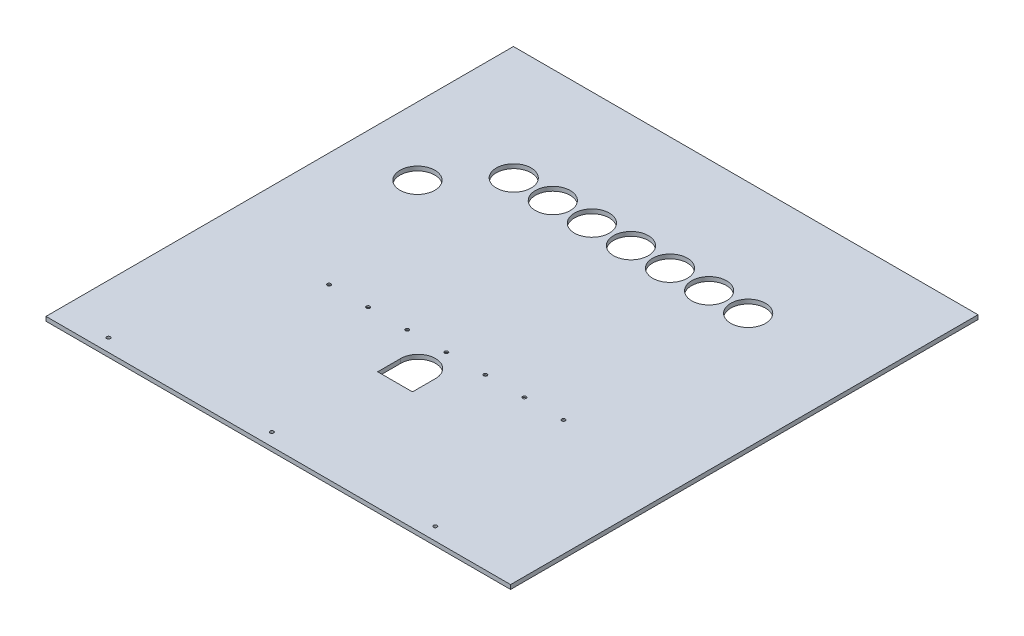
ISO-10303-21;
HEADER;
FILE_DESCRIPTION(('STEP AP214'),'2;1');
FILE_NAME('part.step','',(''),(''),'','','');
FILE_SCHEMA(('AUTOMOTIVE_DESIGN { 1 0 10303 214 1 1 1 1 }'));
ENDSEC;
DATA;
#1=APPLICATION_CONTEXT('core data for automotive mechanical design processes');
#2=APPLICATION_PROTOCOL_DEFINITION('international standard','automotive_design',2000,#1);
#3=PRODUCT_CONTEXT('',#1,'mechanical');
#4=PRODUCT('Part','Part','',(#3));
#5=PRODUCT_RELATED_PRODUCT_CATEGORY('part','',(#4));
#6=PRODUCT_DEFINITION_FORMATION('','',#4);
#7=PRODUCT_DEFINITION_CONTEXT('part definition',#1,'design');
#8=PRODUCT_DEFINITION('design','',#6,#7);
#9=PRODUCT_DEFINITION_SHAPE('','',#8);
#10=(LENGTH_UNIT() NAMED_UNIT(*) SI_UNIT(.MILLI.,.METRE.));
#11=(NAMED_UNIT(*) PLANE_ANGLE_UNIT() SI_UNIT($,.RADIAN.));
#12=(NAMED_UNIT(*) SI_UNIT($,.STERADIAN.) SOLID_ANGLE_UNIT());
#13=UNCERTAINTY_MEASURE_WITH_UNIT(LENGTH_MEASURE(1.E-05),#10,'distance_accuracy_value','');
#14=(GEOMETRIC_REPRESENTATION_CONTEXT(3) GLOBAL_UNCERTAINTY_ASSIGNED_CONTEXT((#13)) GLOBAL_UNIT_ASSIGNED_CONTEXT((#10,
#11,#12)) REPRESENTATION_CONTEXT('',''));
#15=CARTESIAN_POINT('',(0.,0.,0.));
#16=DIRECTION('',(0.,0.,1.));
#17=DIRECTION('',(1.,0.,0.));
#18=AXIS2_PLACEMENT_3D('',#15,#16,#17);
#19=CARTESIAN_POINT('',(0.,6.,0.));
#20=DIRECTION('',(0.,-1.,0.));
#21=DIRECTION('',(0.,0.,-1.));
#22=AXIS2_PLACEMENT_3D('',#19,#20,#21);
#23=PLANE('',#22);
#24=CARTESIAN_POINT('',(230.,6.,286.23));
#25=DIRECTION('',(0.,1.,0.));
#26=DIRECTION('',(0.,0.,1.));
#27=AXIS2_PLACEMENT_3D('',#24,#25,#26);
#28=CIRCLE('',#27,2.5);
#29=CARTESIAN_POINT('',(230.,6.,288.73));
#30=VERTEX_POINT('',#29);
#31=EDGE_CURVE('E100',#30,#30,#28,.T.);
#32=ORIENTED_EDGE('',*,*,#31,.F.);
#33=EDGE_LOOP('',(#32));
#34=FACE_BOUND('',#33,.T.);
#35=CARTESIAN_POINT('',(0.,6.,286.23));
#36=DIRECTION('',(0.,1.,0.));
#37=DIRECTION('',(0.,0.,1.));
#38=AXIS2_PLACEMENT_3D('',#35,#36,#37);
#39=CIRCLE('',#38,2.5);
#40=CARTESIAN_POINT('',(0.,6.,288.73));
#41=VERTEX_POINT('',#40);
#42=EDGE_CURVE('E121',#41,#41,#39,.T.);
#43=ORIENTED_EDGE('',*,*,#42,.F.);
#44=EDGE_LOOP('',(#43));
#45=FACE_BOUND('',#44,.T.);
#46=CARTESIAN_POINT('',(-230.,6.,286.23));
#47=DIRECTION('',(0.,1.,0.));
#48=DIRECTION('',(0.,0.,1.));
#49=AXIS2_PLACEMENT_3D('',#46,#47,#48);
#50=CIRCLE('',#49,2.5);
#51=CARTESIAN_POINT('',(-230.,6.,288.73));
#52=VERTEX_POINT('',#51);
#53=EDGE_CURVE('E125',#52,#52,#50,.T.);
#54=ORIENTED_EDGE('',*,*,#53,.F.);
#55=EDGE_LOOP('',(#54));
#56=FACE_BOUND('',#55,.T.);
#57=CARTESIAN_POINT('',(25.5000000000006,6.,105.904736767257));
#58=DIRECTION('',(0.,-1.,0.));
#59=DIRECTION('',(0.,0.,-1.));
#60=AXIS2_PLACEMENT_3D('',#57,#58,#59);
#61=CIRCLE('',#60,24.5);
#62=CARTESIAN_POINT('',(50.0000000000008,6.,105.904736767257));
#63=VERTEX_POINT('',#62);
#64=CARTESIAN_POINT('',(1.00000000000035,6.,105.904736767257));
#65=VERTEX_POINT('',#64);
#66=EDGE_CURVE('E130',#63,#65,#61,.F.);
#67=ORIENTED_EDGE('',*,*,#66,.F.);
#68=DIRECTION('',(0.,0.,-1.));
#69=VECTOR('',#68,1.);
#70=CARTESIAN_POINT('',(50.0000000000006,6.,138.347210855597));
#71=LINE('',#70,#69);
#72=CARTESIAN_POINT('',(50.0000000000006,6.,138.347210855597));
#73=VERTEX_POINT('',#72);
#74=EDGE_CURVE('E133',#73,#63,#71,.T.);
#75=ORIENTED_EDGE('',*,*,#74,.F.);
#76=DIRECTION('',(1.,0.,0.));
#77=VECTOR('',#76,1.);
#78=CARTESIAN_POINT('',(50.0000000000006,6.,138.347210855597));
#79=LINE('',#78,#77);
#80=CARTESIAN_POINT('',(1.00000000000035,6.,138.347210855597));
#81=VERTEX_POINT('',#80);
#82=EDGE_CURVE('E149',#81,#73,#79,.T.);
#83=ORIENTED_EDGE('',*,*,#82,.F.);
#84=DIRECTION('',(0.,0.,1.));
#85=VECTOR('',#84,1.);
#86=CARTESIAN_POINT('',(1.00000000000035,6.,138.347210855597));
#87=LINE('',#86,#85);
#88=EDGE_CURVE('E34',#65,#81,#87,.T.);
#89=ORIENTED_EDGE('',*,*,#88,.F.);
#90=EDGE_LOOP('',(#67,#75,#83,#89));
#91=FACE_BOUND('',#90,.T.);
#92=CARTESIAN_POINT('',(190.5,6.,66.27));
#93=DIRECTION('',(0.,1.,0.));
#94=DIRECTION('',(0.,0.,1.));
#95=AXIS2_PLACEMENT_3D('',#92,#93,#94);
#96=CIRCLE('',#95,2.5);
#97=CARTESIAN_POINT('',(190.5,6.,68.77));
#98=VERTEX_POINT('',#97);
#99=EDGE_CURVE('E240',#98,#98,#96,.T.);
#100=ORIENTED_EDGE('',*,*,#99,.F.);
#101=EDGE_LOOP('',(#100));
#102=FACE_BOUND('',#101,.T.);
#103=CARTESIAN_POINT('',(135.5,6.,66.27));
#104=DIRECTION('',(0.,1.,0.));
#105=DIRECTION('',(0.,0.,1.));
#106=AXIS2_PLACEMENT_3D('',#103,#104,#105);
#107=CIRCLE('',#106,2.5);
#108=CARTESIAN_POINT('',(135.5,6.,68.77));
#109=VERTEX_POINT('',#108);
#110=EDGE_CURVE('E234',#109,#109,#107,.T.);
#111=ORIENTED_EDGE('',*,*,#110,.F.);
#112=EDGE_LOOP('',(#111));
#113=FACE_BOUND('',#112,.T.);
#114=CARTESIAN_POINT('',(80.5,6.,66.27));
#115=DIRECTION('',(0.,1.,0.));
#116=DIRECTION('',(0.,0.,1.));
#117=AXIS2_PLACEMENT_3D('',#114,#115,#116);
#118=CIRCLE('',#117,2.5);
#119=CARTESIAN_POINT('',(80.5,6.,68.77));
#120=VERTEX_POINT('',#119);
#121=EDGE_CURVE('E228',#120,#120,#118,.T.);
#122=ORIENTED_EDGE('',*,*,#121,.F.);
#123=EDGE_LOOP('',(#122));
#124=FACE_BOUND('',#123,.T.);
#125=CARTESIAN_POINT('',(25.5,6.,66.27));
#126=DIRECTION('',(0.,1.,0.));
#127=DIRECTION('',(0.,0.,1.));
#128=AXIS2_PLACEMENT_3D('',#125,#126,#127);
#129=CIRCLE('',#128,2.5);
#130=CARTESIAN_POINT('',(25.5,6.,68.77));
#131=VERTEX_POINT('',#130);
#132=EDGE_CURVE('E222',#131,#131,#129,.T.);
#133=ORIENTED_EDGE('',*,*,#132,.F.);
#134=EDGE_LOOP('',(#133));
#135=FACE_BOUND('',#134,.T.);
#136=CARTESIAN_POINT('',(-29.5,6.,66.27));
#137=DIRECTION('',(0.,1.,0.));
#138=DIRECTION('',(0.,0.,1.));
#139=AXIS2_PLACEMENT_3D('',#136,#137,#138);
#140=CIRCLE('',#139,2.5);
#141=CARTESIAN_POINT('',(-29.5,6.,68.77));
#142=VERTEX_POINT('',#141);
#143=EDGE_CURVE('E216',#142,#142,#140,.T.);
#144=ORIENTED_EDGE('',*,*,#143,.F.);
#145=EDGE_LOOP('',(#144));
#146=FACE_BOUND('',#145,.T.);
#147=CARTESIAN_POINT('',(-84.5,6.,66.27));
#148=DIRECTION('',(0.,1.,0.));
#149=DIRECTION('',(0.,0.,1.));
#150=AXIS2_PLACEMENT_3D('',#147,#148,#149);
#151=CIRCLE('',#150,2.5);
#152=CARTESIAN_POINT('',(-84.5,6.,68.77));
#153=VERTEX_POINT('',#152);
#154=EDGE_CURVE('E210',#153,#153,#151,.T.);
#155=ORIENTED_EDGE('',*,*,#154,.F.);
#156=EDGE_LOOP('',(#155));
#157=FACE_BOUND('',#156,.T.);
#158=CARTESIAN_POINT('',(-139.5,6.,66.27));
#159=DIRECTION('',(0.,1.,0.));
#160=DIRECTION('',(0.,0.,1.));
#161=AXIS2_PLACEMENT_3D('',#158,#159,#160);
#162=CIRCLE('',#161,2.5);
#163=CARTESIAN_POINT('',(-139.5,6.,68.77));
#164=VERTEX_POINT('',#163);
#165=EDGE_CURVE('E186',#164,#164,#162,.T.);
#166=ORIENTED_EDGE('',*,*,#165,.F.);
#167=EDGE_LOOP('',(#166));
#168=FACE_BOUND('',#167,.T.);
#169=CARTESIAN_POINT('',(-139.5,6.,-193.73));
#170=DIRECTION('',(0.,1.,0.));
#171=DIRECTION('',(0.,0.,1.));
#172=AXIS2_PLACEMENT_3D('',#169,#170,#171);
#173=CIRCLE('',#172,24.5);
#174=CARTESIAN_POINT('',(-139.5,6.,-169.23));
#175=VERTEX_POINT('',#174);
#176=EDGE_CURVE('E193',#175,#175,#173,.T.);
#177=ORIENTED_EDGE('',*,*,#176,.F.);
#178=EDGE_LOOP('',(#177));
#179=FACE_BOUND('',#178,.T.);
#180=CARTESIAN_POINT('',(-84.5,6.,-193.73));
#181=DIRECTION('',(0.,1.,0.));
#182=DIRECTION('',(0.,0.,1.));
#183=AXIS2_PLACEMENT_3D('',#180,#181,#182);
#184=CIRCLE('',#183,24.5);
#185=CARTESIAN_POINT('',(-84.5,6.,-169.23));
#186=VERTEX_POINT('',#185);
#187=EDGE_CURVE('E197',#186,#186,#184,.T.);
#188=ORIENTED_EDGE('',*,*,#187,.F.);
#189=EDGE_LOOP('',(#188));
#190=FACE_BOUND('',#189,.T.);
#191=CARTESIAN_POINT('',(-29.5,6.,-193.73));
#192=DIRECTION('',(0.,1.,0.));
#193=DIRECTION('',(0.,0.,1.));
#194=AXIS2_PLACEMENT_3D('',#191,#192,#193);
#195=CIRCLE('',#194,24.5);
#196=CARTESIAN_POINT('',(-29.5,6.,-169.23));
#197=VERTEX_POINT('',#196);
#198=EDGE_CURVE('E200',#197,#197,#195,.T.);
#199=ORIENTED_EDGE('',*,*,#198,.F.);
#200=EDGE_LOOP('',(#199));
#201=FACE_BOUND('',#200,.T.);
#202=CARTESIAN_POINT('',(25.5,6.,-193.73));
#203=DIRECTION('',(0.,1.,0.));
#204=DIRECTION('',(0.,0.,1.));
#205=AXIS2_PLACEMENT_3D('',#202,#203,#204);
#206=CIRCLE('',#205,24.5);
#207=CARTESIAN_POINT('',(25.5,6.,-169.23));
#208=VERTEX_POINT('',#207);
#209=EDGE_CURVE('E190',#208,#208,#206,.T.);
#210=ORIENTED_EDGE('',*,*,#209,.F.);
#211=EDGE_LOOP('',(#210));
#212=FACE_BOUND('',#211,.T.);
#213=CARTESIAN_POINT('',(-204.5,6.,-123.171883561143));
#214=DIRECTION('',(0.,1.,0.));
#215=DIRECTION('',(0.,0.,1.));
#216=AXIS2_PLACEMENT_3D('',#213,#214,#215);
#217=CIRCLE('',#216,24.5);
#218=CARTESIAN_POINT('',(-204.5,6.,-98.6718835611434));
#219=VERTEX_POINT('',#218);
#220=EDGE_CURVE('E196',#219,#219,#217,.T.);
#221=ORIENTED_EDGE('',*,*,#220,.F.);
#222=EDGE_LOOP('',(#221));
#223=FACE_BOUND('',#222,.T.);
#224=DIRECTION('',(1.,0.,0.));
#225=VECTOR('',#224,1.);
#226=CARTESIAN_POINT('',(-300.,6.,304.23));
#227=LINE('',#226,#225);
#228=CARTESIAN_POINT('',(-300.,6.,304.23));
#229=VERTEX_POINT('',#228);
#230=CARTESIAN_POINT('',(354.,6.,304.23));
#231=VERTEX_POINT('',#230);
#232=EDGE_CURVE('E26',#229,#231,#227,.T.);
#233=ORIENTED_EDGE('',*,*,#232,.T.);
#234=DIRECTION('',(0.,0.,-1.));
#235=VECTOR('',#234,1.);
#236=CARTESIAN_POINT('',(354.,6.,-353.77));
#237=LINE('',#236,#235);
#238=CARTESIAN_POINT('',(354.,6.,-353.77));
#239=VERTEX_POINT('',#238);
#240=EDGE_CURVE('E87',#231,#239,#237,.T.);
#241=ORIENTED_EDGE('',*,*,#240,.T.);
#242=DIRECTION('',(-1.,0.,0.));
#243=VECTOR('',#242,1.);
#244=CARTESIAN_POINT('',(-300.,6.,-353.77));
#245=LINE('',#244,#243);
#246=CARTESIAN_POINT('',(-300.,6.,-353.77));
#247=VERTEX_POINT('',#246);
#248=EDGE_CURVE('E106',#239,#247,#245,.T.);
#249=ORIENTED_EDGE('',*,*,#248,.T.);
#250=DIRECTION('',(0.,0.,1.));
#251=VECTOR('',#250,1.);
#252=CARTESIAN_POINT('',(-300.,6.,304.23));
#253=LINE('',#252,#251);
#254=EDGE_CURVE('E89',#247,#229,#253,.T.);
#255=ORIENTED_EDGE('',*,*,#254,.T.);
#256=EDGE_LOOP('',(#233,#241,#249,#255));
#257=FACE_BOUND('',#256,.T.);
#258=CARTESIAN_POINT('',(80.5,6.,-193.73));
#259=DIRECTION('',(0.,1.,0.));
#260=DIRECTION('',(0.,0.,1.));
#261=AXIS2_PLACEMENT_3D('',#258,#259,#260);
#262=CIRCLE('',#261,24.5);
#263=CARTESIAN_POINT('',(80.5,6.,-169.23));
#264=VERTEX_POINT('',#263);
#265=EDGE_CURVE('E187',#264,#264,#262,.F.);
#266=ORIENTED_EDGE('',*,*,#265,.T.);
#267=EDGE_LOOP('',(#266));
#268=FACE_BOUND('',#267,.T.);
#269=CARTESIAN_POINT('',(135.5,6.,-193.73));
#270=DIRECTION('',(0.,1.,0.));
#271=DIRECTION('',(0.,0.,1.));
#272=AXIS2_PLACEMENT_3D('',#269,#270,#271);
#273=CIRCLE('',#272,24.5);
#274=CARTESIAN_POINT('',(135.5,6.,-169.23));
#275=VERTEX_POINT('',#274);
#276=EDGE_CURVE('E185',#275,#275,#273,.F.);
#277=ORIENTED_EDGE('',*,*,#276,.T.);
#278=EDGE_LOOP('',(#277));
#279=FACE_BOUND('',#278,.T.);
#280=CARTESIAN_POINT('',(190.5,6.,-193.73));
#281=DIRECTION('',(0.,1.,0.));
#282=DIRECTION('',(0.,0.,1.));
#283=AXIS2_PLACEMENT_3D('',#280,#281,#282);
#284=CIRCLE('',#283,24.5);
#285=CARTESIAN_POINT('',(190.5,6.,-169.23));
#286=VERTEX_POINT('',#285);
#287=EDGE_CURVE('E182',#286,#286,#284,.F.);
#288=ORIENTED_EDGE('',*,*,#287,.T.);
#289=EDGE_LOOP('',(#288));
#290=FACE_BOUND('',#289,.T.);
#291=ADVANCED_FACE('F17',(#34,#45,#56,#91,#102,#113,#124,#135,#146,#157,#168,#179,#190,#201,
#212,#223,#257,#268,#279,#290),#23,.F.);
#292=CARTESIAN_POINT('',(-300.,6.,304.23));
#293=DIRECTION('',(1.,0.,0.));
#294=DIRECTION('',(0.,0.,-1.));
#295=AXIS2_PLACEMENT_3D('',#292,#293,#294);
#296=PLANE('',#295);
#297=DIRECTION('',(0.,0.,1.));
#298=VECTOR('',#297,1.);
#299=CARTESIAN_POINT('',(-300.,0.,304.23));
#300=LINE('',#299,#298);
#301=CARTESIAN_POINT('',(-300.,0.,-353.77));
#302=VERTEX_POINT('',#301);
#303=CARTESIAN_POINT('',(-300.,0.,304.23));
#304=VERTEX_POINT('',#303);
#305=EDGE_CURVE('E247',#302,#304,#300,.T.);
#306=ORIENTED_EDGE('',*,*,#305,.T.);
#307=DIRECTION('',(0.,-1.,0.));
#308=VECTOR('',#307,1.);
#309=CARTESIAN_POINT('',(-300.,6.,304.23));
#310=LINE('',#309,#308);
#311=EDGE_CURVE('E11',#229,#304,#310,.T.);
#312=ORIENTED_EDGE('',*,*,#311,.F.);
#313=ORIENTED_EDGE('',*,*,#254,.F.);
#314=DIRECTION('',(0.,-1.,0.));
#315=VECTOR('',#314,1.);
#316=CARTESIAN_POINT('',(-300.,6.,-353.77));
#317=LINE('',#316,#315);
#318=EDGE_CURVE('E109',#247,#302,#317,.T.);
#319=ORIENTED_EDGE('',*,*,#318,.T.);
#320=EDGE_LOOP('',(#306,#312,#313,#319));
#321=FACE_BOUND('',#320,.T.);
#322=ADVANCED_FACE('F19',(#321),#296,.F.);
#323=CARTESIAN_POINT('',(-300.,6.,304.23));
#324=DIRECTION('',(0.,0.,-1.));
#325=DIRECTION('',(-1.,0.,0.));
#326=AXIS2_PLACEMENT_3D('',#323,#324,#325);
#327=PLANE('',#326);
#328=DIRECTION('',(1.,0.,0.));
#329=VECTOR('',#328,1.);
#330=CARTESIAN_POINT('',(-300.,0.,304.23));
#331=LINE('',#330,#329);
#332=CARTESIAN_POINT('',(354.,0.,304.23));
#333=VERTEX_POINT('',#332);
#334=EDGE_CURVE('E97',#304,#333,#331,.T.);
#335=ORIENTED_EDGE('',*,*,#334,.T.);
#336=DIRECTION('',(0.,-1.,0.));
#337=VECTOR('',#336,1.);
#338=CARTESIAN_POINT('',(354.,6.,304.23));
#339=LINE('',#338,#337);
#340=EDGE_CURVE('E94',#231,#333,#339,.T.);
#341=ORIENTED_EDGE('',*,*,#340,.F.);
#342=ORIENTED_EDGE('',*,*,#232,.F.);
#343=ORIENTED_EDGE('',*,*,#311,.T.);
#344=EDGE_LOOP('',(#335,#341,#342,#343));
#345=FACE_BOUND('',#344,.T.);
#346=ADVANCED_FACE('F95',(#345),#327,.F.);
#347=CARTESIAN_POINT('',(0.,0.,0.));
#348=DIRECTION('',(0.,-1.,0.));
#349=DIRECTION('',(0.,0.,-1.));
#350=AXIS2_PLACEMENT_3D('',#347,#348,#349);
#351=PLANE('',#350);
#352=CARTESIAN_POINT('',(230.,0.,286.23));
#353=DIRECTION('',(0.,-1.,0.));
#354=DIRECTION('',(0.,0.,-1.));
#355=AXIS2_PLACEMENT_3D('',#352,#353,#354);
#356=CIRCLE('',#355,2.5);
#357=CARTESIAN_POINT('',(230.,0.,283.73));
#358=VERTEX_POINT('',#357);
#359=EDGE_CURVE('E21',#358,#358,#356,.T.);
#360=ORIENTED_EDGE('',*,*,#359,.F.);
#361=EDGE_LOOP('',(#360));
#362=FACE_BOUND('',#361,.T.);
#363=CARTESIAN_POINT('',(0.,0.,286.23));
#364=DIRECTION('',(0.,-1.,0.));
#365=DIRECTION('',(0.,0.,-1.));
#366=AXIS2_PLACEMENT_3D('',#363,#364,#365);
#367=CIRCLE('',#366,2.5);
#368=CARTESIAN_POINT('',(0.,0.,283.73));
#369=VERTEX_POINT('',#368);
#370=EDGE_CURVE('E124',#369,#369,#367,.T.);
#371=ORIENTED_EDGE('',*,*,#370,.F.);
#372=EDGE_LOOP('',(#371));
#373=FACE_BOUND('',#372,.T.);
#374=CARTESIAN_POINT('',(-230.,0.,286.23));
#375=DIRECTION('',(0.,-1.,0.));
#376=DIRECTION('',(0.,0.,-1.));
#377=AXIS2_PLACEMENT_3D('',#374,#375,#376);
#378=CIRCLE('',#377,2.5);
#379=CARTESIAN_POINT('',(-230.,0.,283.73));
#380=VERTEX_POINT('',#379);
#381=EDGE_CURVE('E128',#380,#380,#378,.T.);
#382=ORIENTED_EDGE('',*,*,#381,.F.);
#383=EDGE_LOOP('',(#382));
#384=FACE_BOUND('',#383,.T.);
#385=DIRECTION('',(0.,0.,1.));
#386=VECTOR('',#385,1.);
#387=CARTESIAN_POINT('',(50.0000000000006,0.,138.347210855597));
#388=LINE('',#387,#386);
#389=CARTESIAN_POINT('',(50.0000000000008,0.,105.904736767257));
#390=VERTEX_POINT('',#389);
#391=CARTESIAN_POINT('',(50.0000000000006,0.,138.347210855597));
#392=VERTEX_POINT('',#391);
#393=EDGE_CURVE('E42',#390,#392,#388,.T.);
#394=ORIENTED_EDGE('',*,*,#393,.F.);
#395=CARTESIAN_POINT('',(25.5000000000006,0.,105.904736767257));
#396=DIRECTION('',(0.,-1.,0.));
#397=DIRECTION('',(0.,0.,-1.));
#398=AXIS2_PLACEMENT_3D('',#395,#396,#397);
#399=CIRCLE('',#398,24.5);
#400=CARTESIAN_POINT('',(1.00000000000035,0.,105.904736767257));
#401=VERTEX_POINT('',#400);
#402=EDGE_CURVE('E143',#401,#390,#399,.T.);
#403=ORIENTED_EDGE('',*,*,#402,.F.);
#404=DIRECTION('',(0.,0.,-1.));
#405=VECTOR('',#404,1.);
#406=CARTESIAN_POINT('',(1.00000000000035,0.,138.347210855597));
#407=LINE('',#406,#405);
#408=CARTESIAN_POINT('',(1.00000000000035,0.,138.347210855597));
#409=VERTEX_POINT('',#408);
#410=EDGE_CURVE('E140',#409,#401,#407,.T.);
#411=ORIENTED_EDGE('',*,*,#410,.F.);
#412=DIRECTION('',(-1.,0.,0.));
#413=VECTOR('',#412,1.);
#414=CARTESIAN_POINT('',(50.0000000000006,0.,138.347210855597));
#415=LINE('',#414,#413);
#416=EDGE_CURVE('E137',#392,#409,#415,.T.);
#417=ORIENTED_EDGE('',*,*,#416,.F.);
#418=EDGE_LOOP('',(#394,#403,#411,#417));
#419=FACE_BOUND('',#418,.T.);
#420=CARTESIAN_POINT('',(190.5,0.,-193.73));
#421=DIRECTION('',(0.,1.,0.));
#422=DIRECTION('',(0.,0.,1.));
#423=AXIS2_PLACEMENT_3D('',#420,#421,#422);
#424=CIRCLE('',#423,24.5);
#425=CARTESIAN_POINT('',(190.5,0.,-169.23));
#426=VERTEX_POINT('',#425);
#427=EDGE_CURVE('E167',#426,#426,#424,.T.);
#428=ORIENTED_EDGE('',*,*,#427,.T.);
#429=EDGE_LOOP('',(#428));
#430=FACE_BOUND('',#429,.T.);
#431=CARTESIAN_POINT('',(135.5,0.,-193.73));
#432=DIRECTION('',(0.,1.,0.));
#433=DIRECTION('',(0.,0.,1.));
#434=AXIS2_PLACEMENT_3D('',#431,#432,#433);
#435=CIRCLE('',#434,24.5);
#436=CARTESIAN_POINT('',(135.5,0.,-169.23));
#437=VERTEX_POINT('',#436);
#438=EDGE_CURVE('E171',#437,#437,#435,.T.);
#439=ORIENTED_EDGE('',*,*,#438,.T.);
#440=EDGE_LOOP('',(#439));
#441=FACE_BOUND('',#440,.T.);
#442=CARTESIAN_POINT('',(80.5,0.,-193.73));
#443=DIRECTION('',(0.,1.,0.));
#444=DIRECTION('',(0.,0.,1.));
#445=AXIS2_PLACEMENT_3D('',#442,#443,#444);
#446=CIRCLE('',#445,24.5);
#447=CARTESIAN_POINT('',(80.5,0.,-169.23));
#448=VERTEX_POINT('',#447);
#449=EDGE_CURVE('E174',#448,#448,#446,.T.);
#450=ORIENTED_EDGE('',*,*,#449,.T.);
#451=EDGE_LOOP('',(#450));
#452=FACE_BOUND('',#451,.T.);
#453=CARTESIAN_POINT('',(25.5,0.,-193.73));
#454=DIRECTION('',(0.,1.,0.));
#455=DIRECTION('',(0.,0.,1.));
#456=AXIS2_PLACEMENT_3D('',#453,#454,#455);
#457=CIRCLE('',#456,24.5);
#458=CARTESIAN_POINT('',(25.5,0.,-169.23));
#459=VERTEX_POINT('',#458);
#460=EDGE_CURVE('E164',#459,#459,#457,.T.);
#461=ORIENTED_EDGE('',*,*,#460,.T.);
#462=EDGE_LOOP('',(#461));
#463=FACE_BOUND('',#462,.T.);
#464=CARTESIAN_POINT('',(-204.5,0.,-123.171883561143));
#465=DIRECTION('',(0.,1.,0.));
#466=DIRECTION('',(0.,0.,1.));
#467=AXIS2_PLACEMENT_3D('',#464,#465,#466);
#468=CIRCLE('',#467,24.5);
#469=CARTESIAN_POINT('',(-204.5,0.,-98.6718835611434));
#470=VERTEX_POINT('',#469);
#471=EDGE_CURVE('E157',#470,#470,#468,.T.);
#472=ORIENTED_EDGE('',*,*,#471,.T.);
#473=EDGE_LOOP('',(#472));
#474=FACE_BOUND('',#473,.T.);
#475=CARTESIAN_POINT('',(-84.5,0.,-193.73));
#476=DIRECTION('',(0.,1.,0.));
#477=DIRECTION('',(0.,0.,1.));
#478=AXIS2_PLACEMENT_3D('',#475,#476,#477);
#479=CIRCLE('',#478,24.5);
#480=CARTESIAN_POINT('',(-84.5,0.,-169.23));
#481=VERTEX_POINT('',#480);
#482=EDGE_CURVE('E160',#481,#481,#479,.T.);
#483=ORIENTED_EDGE('',*,*,#482,.T.);
#484=EDGE_LOOP('',(#483));
#485=FACE_BOUND('',#484,.T.);
#486=CARTESIAN_POINT('',(-29.5,0.,-193.73));
#487=DIRECTION('',(0.,1.,0.));
#488=DIRECTION('',(0.,0.,1.));
#489=AXIS2_PLACEMENT_3D('',#486,#487,#488);
#490=CIRCLE('',#489,24.5);
#491=CARTESIAN_POINT('',(-29.5,0.,-169.23));
#492=VERTEX_POINT('',#491);
#493=EDGE_CURVE('E161',#492,#492,#490,.T.);
#494=ORIENTED_EDGE('',*,*,#493,.T.);
#495=EDGE_LOOP('',(#494));
#496=FACE_BOUND('',#495,.T.);
#497=CARTESIAN_POINT('',(-139.5,0.,-193.73));
#498=DIRECTION('',(0.,1.,0.));
#499=DIRECTION('',(0.,0.,1.));
#500=AXIS2_PLACEMENT_3D('',#497,#498,#499);
#501=CIRCLE('',#500,24.5);
#502=CARTESIAN_POINT('',(-139.5,0.,-169.23));
#503=VERTEX_POINT('',#502);
#504=EDGE_CURVE('E170',#503,#503,#501,.T.);
#505=ORIENTED_EDGE('',*,*,#504,.T.);
#506=EDGE_LOOP('',(#505));
#507=FACE_BOUND('',#506,.T.);
#508=DIRECTION('',(0.,0.,-1.));
#509=VECTOR('',#508,1.);
#510=CARTESIAN_POINT('',(354.,0.,-353.77));
#511=LINE('',#510,#509);
#512=CARTESIAN_POINT('',(354.,0.,-353.77));
#513=VERTEX_POINT('',#512);
#514=EDGE_CURVE('E112',#333,#513,#511,.T.);
#515=ORIENTED_EDGE('',*,*,#514,.F.);
#516=ORIENTED_EDGE('',*,*,#334,.F.);
#517=ORIENTED_EDGE('',*,*,#305,.F.);
#518=DIRECTION('',(-1.,0.,0.));
#519=VECTOR('',#518,1.);
#520=CARTESIAN_POINT('',(-300.,0.,-353.77));
#521=LINE('',#520,#519);
#522=EDGE_CURVE('E107',#513,#302,#521,.T.);
#523=ORIENTED_EDGE('',*,*,#522,.F.);
#524=EDGE_LOOP('',(#515,#516,#517,#523));
#525=FACE_BOUND('',#524,.T.);
#526=ADVANCED_FACE('F258',(#362,#373,#384,#419,#430,#441,#452,#463,#474,#485,#496,#507,#525),
#351,.T.);
#527=CARTESIAN_POINT('',(-204.5,4.,-123.171883561143));
#528=DIRECTION('',(0.,1.,0.));
#529=DIRECTION('',(0.,0.,1.));
#530=AXIS2_PLACEMENT_3D('',#527,#528,#529);
#531=CYLINDRICAL_SURFACE('',#530,24.5);
#532=ORIENTED_EDGE('',*,*,#220,.T.);
#533=EDGE_LOOP('',(#532));
#534=FACE_BOUND('',#533,.T.);
#535=ORIENTED_EDGE('',*,*,#471,.F.);
#536=EDGE_LOOP('',(#535));
#537=FACE_BOUND('',#536,.T.);
#538=ADVANCED_FACE('F261',(#534,#537),#531,.F.);
#539=CARTESIAN_POINT('',(80.5,4.,-193.73));
#540=DIRECTION('',(0.,1.,0.));
#541=DIRECTION('',(0.,0.,1.));
#542=AXIS2_PLACEMENT_3D('',#539,#540,#541);
#543=CYLINDRICAL_SURFACE('',#542,24.5);
#544=ORIENTED_EDGE('',*,*,#265,.F.);
#545=EDGE_LOOP('',(#544));
#546=FACE_BOUND('',#545,.T.);
#547=ORIENTED_EDGE('',*,*,#449,.F.);
#548=EDGE_LOOP('',(#547));
#549=FACE_BOUND('',#548,.T.);
#550=ADVANCED_FACE('F307',(#546,#549),#543,.F.);
#551=CARTESIAN_POINT('',(135.5,4.,-193.73));
#552=DIRECTION('',(0.,1.,0.));
#553=DIRECTION('',(0.,0.,1.));
#554=AXIS2_PLACEMENT_3D('',#551,#552,#553);
#555=CYLINDRICAL_SURFACE('',#554,24.5);
#556=ORIENTED_EDGE('',*,*,#276,.F.);
#557=EDGE_LOOP('',(#556));
#558=FACE_BOUND('',#557,.T.);
#559=ORIENTED_EDGE('',*,*,#438,.F.);
#560=EDGE_LOOP('',(#559));
#561=FACE_BOUND('',#560,.T.);
#562=ADVANCED_FACE('F383',(#558,#561),#555,.F.);
#563=CARTESIAN_POINT('',(190.5,4.,-193.73));
#564=DIRECTION('',(0.,1.,0.));
#565=DIRECTION('',(0.,0.,1.));
#566=AXIS2_PLACEMENT_3D('',#563,#564,#565);
#567=CYLINDRICAL_SURFACE('',#566,24.5);
#568=ORIENTED_EDGE('',*,*,#287,.F.);
#569=EDGE_LOOP('',(#568));
#570=FACE_BOUND('',#569,.T.);
#571=ORIENTED_EDGE('',*,*,#427,.F.);
#572=EDGE_LOOP('',(#571));
#573=FACE_BOUND('',#572,.T.);
#574=ADVANCED_FACE('F371',(#570,#573),#567,.F.);
#575=CARTESIAN_POINT('',(25.5,4.,-193.73));
#576=DIRECTION('',(0.,1.,0.));
#577=DIRECTION('',(0.,0.,1.));
#578=AXIS2_PLACEMENT_3D('',#575,#576,#577);
#579=CYLINDRICAL_SURFACE('',#578,24.5);
#580=ORIENTED_EDGE('',*,*,#209,.T.);
#581=EDGE_LOOP('',(#580));
#582=FACE_BOUND('',#581,.T.);
#583=ORIENTED_EDGE('',*,*,#460,.F.);
#584=EDGE_LOOP('',(#583));
#585=FACE_BOUND('',#584,.T.);
#586=ADVANCED_FACE('F367',(#582,#585),#579,.F.);
#587=CARTESIAN_POINT('',(-29.5,4.,-193.73));
#588=DIRECTION('',(0.,1.,0.));
#589=DIRECTION('',(0.,0.,1.));
#590=AXIS2_PLACEMENT_3D('',#587,#588,#589);
#591=CYLINDRICAL_SURFACE('',#590,24.5);
#592=ORIENTED_EDGE('',*,*,#198,.T.);
#593=EDGE_LOOP('',(#592));
#594=FACE_BOUND('',#593,.T.);
#595=ORIENTED_EDGE('',*,*,#493,.F.);
#596=EDGE_LOOP('',(#595));
#597=FACE_BOUND('',#596,.T.);
#598=ADVANCED_FACE('F370',(#594,#597),#591,.F.);
#599=CARTESIAN_POINT('',(-84.5,4.,-193.73));
#600=DIRECTION('',(0.,1.,0.));
#601=DIRECTION('',(0.,0.,1.));
#602=AXIS2_PLACEMENT_3D('',#599,#600,#601);
#603=CYLINDRICAL_SURFACE('',#602,24.5);
#604=ORIENTED_EDGE('',*,*,#187,.T.);
#605=EDGE_LOOP('',(#604));
#606=FACE_BOUND('',#605,.T.);
#607=ORIENTED_EDGE('',*,*,#482,.F.);
#608=EDGE_LOOP('',(#607));
#609=FACE_BOUND('',#608,.T.);
#610=ADVANCED_FACE('F375',(#606,#609),#603,.F.);
#611=CARTESIAN_POINT('',(-139.5,4.,-193.73));
#612=DIRECTION('',(0.,1.,0.));
#613=DIRECTION('',(0.,0.,1.));
#614=AXIS2_PLACEMENT_3D('',#611,#612,#613);
#615=CYLINDRICAL_SURFACE('',#614,24.5);
#616=ORIENTED_EDGE('',*,*,#176,.T.);
#617=EDGE_LOOP('',(#616));
#618=FACE_BOUND('',#617,.T.);
#619=ORIENTED_EDGE('',*,*,#504,.F.);
#620=EDGE_LOOP('',(#619));
#621=FACE_BOUND('',#620,.T.);
#622=ADVANCED_FACE('F365',(#618,#621),#615,.F.);
#623=CARTESIAN_POINT('',(-139.5,4.,66.27));
#624=DIRECTION('',(0.,1.,0.));
#625=DIRECTION('',(0.,0.,1.));
#626=AXIS2_PLACEMENT_3D('',#623,#624,#625);
#627=CYLINDRICAL_SURFACE('',#626,2.5);
#628=CARTESIAN_POINT('',(-139.5,4.,66.27));
#629=DIRECTION('',(0.,1.,0.));
#630=DIRECTION('',(0.,0.,1.));
#631=AXIS2_PLACEMENT_3D('',#628,#629,#630);
#632=CIRCLE('',#631,2.5);
#633=CARTESIAN_POINT('',(-139.5,4.,68.77));
#634=VERTEX_POINT('',#633);
#635=EDGE_CURVE('E207',#634,#634,#632,.T.);
#636=ORIENTED_EDGE('',*,*,#635,.F.);
#637=EDGE_LOOP('',(#636));
#638=FACE_BOUND('',#637,.T.);
#639=ORIENTED_EDGE('',*,*,#165,.T.);
#640=EDGE_LOOP('',(#639));
#641=FACE_BOUND('',#640,.T.);
#642=ADVANCED_FACE('F361',(#638,#641),#627,.F.);
#643=CARTESIAN_POINT('',(0.,4.,0.));
#644=DIRECTION('',(0.,1.,0.));
#645=DIRECTION('',(0.,0.,1.));
#646=AXIS2_PLACEMENT_3D('',#643,#644,#645);
#647=PLANE('',#646);
#648=ORIENTED_EDGE('',*,*,#635,.T.);
#649=EDGE_LOOP('',(#648));
#650=FACE_BOUND('',#649,.T.);
#651=ADVANCED_FACE('F357',(#650),#647,.T.);
#652=CARTESIAN_POINT('',(-84.5,4.,66.27));
#653=DIRECTION('',(0.,1.,0.));
#654=DIRECTION('',(0.,0.,1.));
#655=AXIS2_PLACEMENT_3D('',#652,#653,#654);
#656=CYLINDRICAL_SURFACE('',#655,2.5);
#657=CARTESIAN_POINT('',(-84.5,4.,66.27));
#658=DIRECTION('',(0.,1.,0.));
#659=DIRECTION('',(0.,0.,1.));
#660=AXIS2_PLACEMENT_3D('',#657,#658,#659);
#661=CIRCLE('',#660,2.5);
#662=CARTESIAN_POINT('',(-84.5,4.,68.77));
#663=VERTEX_POINT('',#662);
#664=EDGE_CURVE('E213',#663,#663,#661,.T.);
#665=ORIENTED_EDGE('',*,*,#664,.F.);
#666=EDGE_LOOP('',(#665));
#667=FACE_BOUND('',#666,.T.);
#668=ORIENTED_EDGE('',*,*,#154,.T.);
#669=EDGE_LOOP('',(#668));
#670=FACE_BOUND('',#669,.T.);
#671=ADVANCED_FACE('F353',(#667,#670),#656,.F.);
#672=CARTESIAN_POINT('',(0.,4.,0.));
#673=DIRECTION('',(0.,1.,0.));
#674=DIRECTION('',(0.,0.,1.));
#675=AXIS2_PLACEMENT_3D('',#672,#673,#674);
#676=PLANE('',#675);
#677=ORIENTED_EDGE('',*,*,#664,.T.);
#678=EDGE_LOOP('',(#677));
#679=FACE_BOUND('',#678,.T.);
#680=ADVANCED_FACE('F349',(#679),#676,.T.);
#681=CARTESIAN_POINT('',(-29.5,4.,66.27));
#682=DIRECTION('',(0.,1.,0.));
#683=DIRECTION('',(0.,0.,1.));
#684=AXIS2_PLACEMENT_3D('',#681,#682,#683);
#685=CYLINDRICAL_SURFACE('',#684,2.5);
#686=CARTESIAN_POINT('',(-29.5,4.,66.27));
#687=DIRECTION('',(0.,1.,0.));
#688=DIRECTION('',(0.,0.,1.));
#689=AXIS2_PLACEMENT_3D('',#686,#687,#688);
#690=CIRCLE('',#689,2.5);
#691=CARTESIAN_POINT('',(-29.5,4.,68.77));
#692=VERTEX_POINT('',#691);
#693=EDGE_CURVE('E219',#692,#692,#690,.T.);
#694=ORIENTED_EDGE('',*,*,#693,.F.);
#695=EDGE_LOOP('',(#694));
#696=FACE_BOUND('',#695,.T.);
#697=ORIENTED_EDGE('',*,*,#143,.T.);
#698=EDGE_LOOP('',(#697));
#699=FACE_BOUND('',#698,.T.);
#700=ADVANCED_FACE('F345',(#696,#699),#685,.F.);
#701=CARTESIAN_POINT('',(0.,4.,0.));
#702=DIRECTION('',(0.,1.,0.));
#703=DIRECTION('',(0.,0.,1.));
#704=AXIS2_PLACEMENT_3D('',#701,#702,#703);
#705=PLANE('',#704);
#706=ORIENTED_EDGE('',*,*,#693,.T.);
#707=EDGE_LOOP('',(#706));
#708=FACE_BOUND('',#707,.T.);
#709=ADVANCED_FACE('F341',(#708),#705,.T.);
#710=CARTESIAN_POINT('',(25.5,4.,66.27));
#711=DIRECTION('',(0.,1.,0.));
#712=DIRECTION('',(0.,0.,1.));
#713=AXIS2_PLACEMENT_3D('',#710,#711,#712);
#714=CYLINDRICAL_SURFACE('',#713,2.5);
#715=CARTESIAN_POINT('',(25.5,4.,66.27));
#716=DIRECTION('',(0.,1.,0.));
#717=DIRECTION('',(0.,0.,1.));
#718=AXIS2_PLACEMENT_3D('',#715,#716,#717);
#719=CIRCLE('',#718,2.5);
#720=CARTESIAN_POINT('',(25.5,4.,68.77));
#721=VERTEX_POINT('',#720);
#722=EDGE_CURVE('E225',#721,#721,#719,.T.);
#723=ORIENTED_EDGE('',*,*,#722,.F.);
#724=EDGE_LOOP('',(#723));
#725=FACE_BOUND('',#724,.T.);
#726=ORIENTED_EDGE('',*,*,#132,.T.);
#727=EDGE_LOOP('',(#726));
#728=FACE_BOUND('',#727,.T.);
#729=ADVANCED_FACE('F337',(#725,#728),#714,.F.);
#730=CARTESIAN_POINT('',(0.,4.,0.));
#731=DIRECTION('',(0.,1.,0.));
#732=DIRECTION('',(0.,0.,1.));
#733=AXIS2_PLACEMENT_3D('',#730,#731,#732);
#734=PLANE('',#733);
#735=ORIENTED_EDGE('',*,*,#722,.T.);
#736=EDGE_LOOP('',(#735));
#737=FACE_BOUND('',#736,.T.);
#738=ADVANCED_FACE('F333',(#737),#734,.T.);
#739=CARTESIAN_POINT('',(80.5,4.,66.27));
#740=DIRECTION('',(0.,1.,0.));
#741=DIRECTION('',(0.,0.,1.));
#742=AXIS2_PLACEMENT_3D('',#739,#740,#741);
#743=CYLINDRICAL_SURFACE('',#742,2.5);
#744=CARTESIAN_POINT('',(80.5,4.,66.27));
#745=DIRECTION('',(0.,1.,0.));
#746=DIRECTION('',(0.,0.,1.));
#747=AXIS2_PLACEMENT_3D('',#744,#745,#746);
#748=CIRCLE('',#747,2.5);
#749=CARTESIAN_POINT('',(80.5,4.,68.77));
#750=VERTEX_POINT('',#749);
#751=EDGE_CURVE('E231',#750,#750,#748,.T.);
#752=ORIENTED_EDGE('',*,*,#751,.F.);
#753=EDGE_LOOP('',(#752));
#754=FACE_BOUND('',#753,.T.);
#755=ORIENTED_EDGE('',*,*,#121,.T.);
#756=EDGE_LOOP('',(#755));
#757=FACE_BOUND('',#756,.T.);
#758=ADVANCED_FACE('F329',(#754,#757),#743,.F.);
#759=CARTESIAN_POINT('',(0.,4.,0.));
#760=DIRECTION('',(0.,1.,0.));
#761=DIRECTION('',(0.,0.,1.));
#762=AXIS2_PLACEMENT_3D('',#759,#760,#761);
#763=PLANE('',#762);
#764=ORIENTED_EDGE('',*,*,#751,.T.);
#765=EDGE_LOOP('',(#764));
#766=FACE_BOUND('',#765,.T.);
#767=ADVANCED_FACE('F325',(#766),#763,.T.);
#768=CARTESIAN_POINT('',(135.5,4.,66.27));
#769=DIRECTION('',(0.,1.,0.));
#770=DIRECTION('',(0.,0.,1.));
#771=AXIS2_PLACEMENT_3D('',#768,#769,#770);
#772=CYLINDRICAL_SURFACE('',#771,2.5);
#773=CARTESIAN_POINT('',(135.5,4.,66.27));
#774=DIRECTION('',(0.,1.,0.));
#775=DIRECTION('',(0.,0.,1.));
#776=AXIS2_PLACEMENT_3D('',#773,#774,#775);
#777=CIRCLE('',#776,2.5);
#778=CARTESIAN_POINT('',(135.5,4.,68.77));
#779=VERTEX_POINT('',#778);
#780=EDGE_CURVE('E237',#779,#779,#777,.T.);
#781=ORIENTED_EDGE('',*,*,#780,.F.);
#782=EDGE_LOOP('',(#781));
#783=FACE_BOUND('',#782,.T.);
#784=ORIENTED_EDGE('',*,*,#110,.T.);
#785=EDGE_LOOP('',(#784));
#786=FACE_BOUND('',#785,.T.);
#787=ADVANCED_FACE('F321',(#783,#786),#772,.F.);
#788=CARTESIAN_POINT('',(0.,4.,0.));
#789=DIRECTION('',(0.,1.,0.));
#790=DIRECTION('',(0.,0.,1.));
#791=AXIS2_PLACEMENT_3D('',#788,#789,#790);
#792=PLANE('',#791);
#793=ORIENTED_EDGE('',*,*,#780,.T.);
#794=EDGE_LOOP('',(#793));
#795=FACE_BOUND('',#794,.T.);
#796=ADVANCED_FACE('F317',(#795),#792,.T.);
#797=CARTESIAN_POINT('',(190.5,4.,66.27));
#798=DIRECTION('',(0.,1.,0.));
#799=DIRECTION('',(0.,0.,1.));
#800=AXIS2_PLACEMENT_3D('',#797,#798,#799);
#801=CYLINDRICAL_SURFACE('',#800,2.5);
#802=CARTESIAN_POINT('',(190.5,4.,66.27));
#803=DIRECTION('',(0.,1.,0.));
#804=DIRECTION('',(0.,0.,1.));
#805=AXIS2_PLACEMENT_3D('',#802,#803,#804);
#806=CIRCLE('',#805,2.5);
#807=CARTESIAN_POINT('',(190.5,4.,68.77));
#808=VERTEX_POINT('',#807);
#809=EDGE_CURVE('E181',#808,#808,#806,.T.);
#810=ORIENTED_EDGE('',*,*,#809,.F.);
#811=EDGE_LOOP('',(#810));
#812=FACE_BOUND('',#811,.T.);
#813=ORIENTED_EDGE('',*,*,#99,.T.);
#814=EDGE_LOOP('',(#813));
#815=FACE_BOUND('',#814,.T.);
#816=ADVANCED_FACE('F313',(#812,#815),#801,.F.);
#817=CARTESIAN_POINT('',(0.,4.,0.));
#818=DIRECTION('',(0.,1.,0.));
#819=DIRECTION('',(0.,0.,1.));
#820=AXIS2_PLACEMENT_3D('',#817,#818,#819);
#821=PLANE('',#820);
#822=ORIENTED_EDGE('',*,*,#809,.T.);
#823=EDGE_LOOP('',(#822));
#824=FACE_BOUND('',#823,.T.);
#825=ADVANCED_FACE('F309',(#824),#821,.T.);
#826=CARTESIAN_POINT('',(50.0000000000006,21.001,138.347210855597));
#827=DIRECTION('',(1.,0.,0.));
#828=DIRECTION('',(0.,0.,-1.));
#829=AXIS2_PLACEMENT_3D('',#826,#827,#828);
#830=PLANE('',#829);
#831=ORIENTED_EDGE('',*,*,#74,.T.);
#832=DIRECTION('',(0.,-1.,0.));
#833=VECTOR('',#832,1.);
#834=CARTESIAN_POINT('',(50.0000000000008,21.001,105.904736767257));
#835=LINE('',#834,#833);
#836=EDGE_CURVE('E147',#63,#390,#835,.T.);
#837=ORIENTED_EDGE('',*,*,#836,.T.);
#838=ORIENTED_EDGE('',*,*,#393,.T.);
#839=DIRECTION('',(0.,-1.,0.));
#840=VECTOR('',#839,1.);
#841=CARTESIAN_POINT('',(50.0000000000006,21.001,138.347210855597));
#842=LINE('',#841,#840);
#843=EDGE_CURVE('E146',#73,#392,#842,.T.);
#844=ORIENTED_EDGE('',*,*,#843,.F.);
#845=EDGE_LOOP('',(#831,#837,#838,#844));
#846=FACE_BOUND('',#845,.T.);
#847=ADVANCED_FACE('F312',(#846),#830,.F.);
#848=CARTESIAN_POINT('',(25.5000000000006,21.001,105.904736767257));
#849=DIRECTION('',(0.,-1.,0.));
#850=DIRECTION('',(0.,0.,-1.));
#851=AXIS2_PLACEMENT_3D('',#848,#849,#850);
#852=CYLINDRICAL_SURFACE('',#851,24.5);
#853=ORIENTED_EDGE('',*,*,#66,.T.);
#854=DIRECTION('',(0.,-1.,0.));
#855=VECTOR('',#854,1.);
#856=CARTESIAN_POINT('',(1.00000000000035,21.001,105.904736767257));
#857=LINE('',#856,#855);
#858=EDGE_CURVE('E150',#65,#401,#857,.T.);
#859=ORIENTED_EDGE('',*,*,#858,.T.);
#860=ORIENTED_EDGE('',*,*,#402,.T.);
#861=ORIENTED_EDGE('',*,*,#836,.F.);
#862=EDGE_LOOP('',(#853,#859,#860,#861));
#863=FACE_BOUND('',#862,.T.);
#864=ADVANCED_FACE('F395',(#863),#852,.F.);
#865=CARTESIAN_POINT('',(1.00000000000035,21.001,138.347210855597));
#866=DIRECTION('',(-1.,0.,0.));
#867=DIRECTION('',(0.,0.,1.));
#868=AXIS2_PLACEMENT_3D('',#865,#866,#867);
#869=PLANE('',#868);
#870=ORIENTED_EDGE('',*,*,#88,.T.);
#871=DIRECTION('',(0.,-1.,0.));
#872=VECTOR('',#871,1.);
#873=CARTESIAN_POINT('',(1.00000000000035,21.001,138.347210855597));
#874=LINE('',#873,#872);
#875=EDGE_CURVE('E152',#81,#409,#874,.T.);
#876=ORIENTED_EDGE('',*,*,#875,.T.);
#877=ORIENTED_EDGE('',*,*,#410,.T.);
#878=ORIENTED_EDGE('',*,*,#858,.F.);
#879=EDGE_LOOP('',(#870,#876,#877,#878));
#880=FACE_BOUND('',#879,.T.);
#881=ADVANCED_FACE('F400',(#880),#869,.F.);
#882=CARTESIAN_POINT('',(50.0000000000006,21.001,138.347210855597));
#883=DIRECTION('',(0.,0.,1.));
#884=DIRECTION('',(1.,0.,0.));
#885=AXIS2_PLACEMENT_3D('',#882,#883,#884);
#886=PLANE('',#885);
#887=ORIENTED_EDGE('',*,*,#82,.T.);
#888=ORIENTED_EDGE('',*,*,#843,.T.);
#889=ORIENTED_EDGE('',*,*,#416,.T.);
#890=ORIENTED_EDGE('',*,*,#875,.F.);
#891=EDGE_LOOP('',(#887,#888,#889,#890));
#892=FACE_BOUND('',#891,.T.);
#893=ADVANCED_FACE('F396',(#892),#886,.F.);
#894=CARTESIAN_POINT('',(-230.,-4.,286.23));
#895=DIRECTION('',(0.,1.,0.));
#896=DIRECTION('',(0.,0.,1.));
#897=AXIS2_PLACEMENT_3D('',#894,#895,#896);
#898=CYLINDRICAL_SURFACE('',#897,2.5);
#899=ORIENTED_EDGE('',*,*,#381,.T.);
#900=EDGE_LOOP('',(#899));
#901=FACE_BOUND('',#900,.T.);
#902=ORIENTED_EDGE('',*,*,#53,.T.);
#903=EDGE_LOOP('',(#902));
#904=FACE_BOUND('',#903,.T.);
#905=ADVANCED_FACE('F399',(#901,#904),#898,.F.);
#906=CARTESIAN_POINT('',(0.,-4.,286.23));
#907=DIRECTION('',(0.,1.,0.));
#908=DIRECTION('',(0.,0.,1.));
#909=AXIS2_PLACEMENT_3D('',#906,#907,#908);
#910=CYLINDRICAL_SURFACE('',#909,2.5);
#911=ORIENTED_EDGE('',*,*,#370,.T.);
#912=EDGE_LOOP('',(#911));
#913=FACE_BOUND('',#912,.T.);
#914=ORIENTED_EDGE('',*,*,#42,.T.);
#915=EDGE_LOOP('',(#914));
#916=FACE_BOUND('',#915,.T.);
#917=ADVANCED_FACE('F255',(#913,#916),#910,.F.);
#918=CARTESIAN_POINT('',(230.,-4.,286.23));
#919=DIRECTION('',(0.,1.,0.));
#920=DIRECTION('',(0.,0.,1.));
#921=AXIS2_PLACEMENT_3D('',#918,#919,#920);
#922=CYLINDRICAL_SURFACE('',#921,2.5);
#923=ORIENTED_EDGE('',*,*,#359,.T.);
#924=EDGE_LOOP('',(#923));
#925=FACE_BOUND('',#924,.T.);
#926=ORIENTED_EDGE('',*,*,#31,.T.);
#927=EDGE_LOOP('',(#926));
#928=FACE_BOUND('',#927,.T.);
#929=ADVANCED_FACE('F412',(#925,#928),#922,.F.);
#930=CARTESIAN_POINT('',(354.,6.,-353.77));
#931=DIRECTION('',(-1.,0.,0.));
#932=DIRECTION('',(0.,0.,1.));
#933=AXIS2_PLACEMENT_3D('',#930,#931,#932);
#934=PLANE('',#933);
#935=ORIENTED_EDGE('',*,*,#514,.T.);
#936=DIRECTION('',(0.,-1.,0.));
#937=VECTOR('',#936,1.);
#938=CARTESIAN_POINT('',(354.,6.,-353.77));
#939=LINE('',#938,#937);
#940=EDGE_CURVE('E101',#239,#513,#939,.T.);
#941=ORIENTED_EDGE('',*,*,#940,.F.);
#942=ORIENTED_EDGE('',*,*,#240,.F.);
#943=ORIENTED_EDGE('',*,*,#340,.T.);
#944=EDGE_LOOP('',(#935,#941,#942,#943));
#945=FACE_BOUND('',#944,.T.);
#946=ADVANCED_FACE('F103',(#945),#934,.F.);
#947=CARTESIAN_POINT('',(-300.,6.,-353.77));
#948=DIRECTION('',(0.,0.,1.));
#949=DIRECTION('',(1.,0.,0.));
#950=AXIS2_PLACEMENT_3D('',#947,#948,#949);
#951=PLANE('',#950);
#952=ORIENTED_EDGE('',*,*,#522,.T.);
#953=ORIENTED_EDGE('',*,*,#318,.F.);
#954=ORIENTED_EDGE('',*,*,#248,.F.);
#955=ORIENTED_EDGE('',*,*,#940,.T.);
#956=EDGE_LOOP('',(#952,#953,#954,#955));
#957=FACE_BOUND('',#956,.T.);
#958=ADVANCED_FACE('F287',(#957),#951,.F.);
#959=CLOSED_SHELL('',(#291,#322,#346,#526,#538,#550,#562,#574,#586,#598,#610,#622,#642,#651,
#671,#680,#700,#709,#729,#738,#758,#767,#787,#796,#816,#825,#847,#864,#881,#893,#905,#917,#929,
#946,#958));
#960=MANIFOLD_SOLID_BREP('B1',#959);
#961=ADVANCED_BREP_SHAPE_REPRESENTATION('',(#18,#960),#14);
#962=SHAPE_DEFINITION_REPRESENTATION(#9,#961);
ENDSEC;
END-ISO-10303-21;
